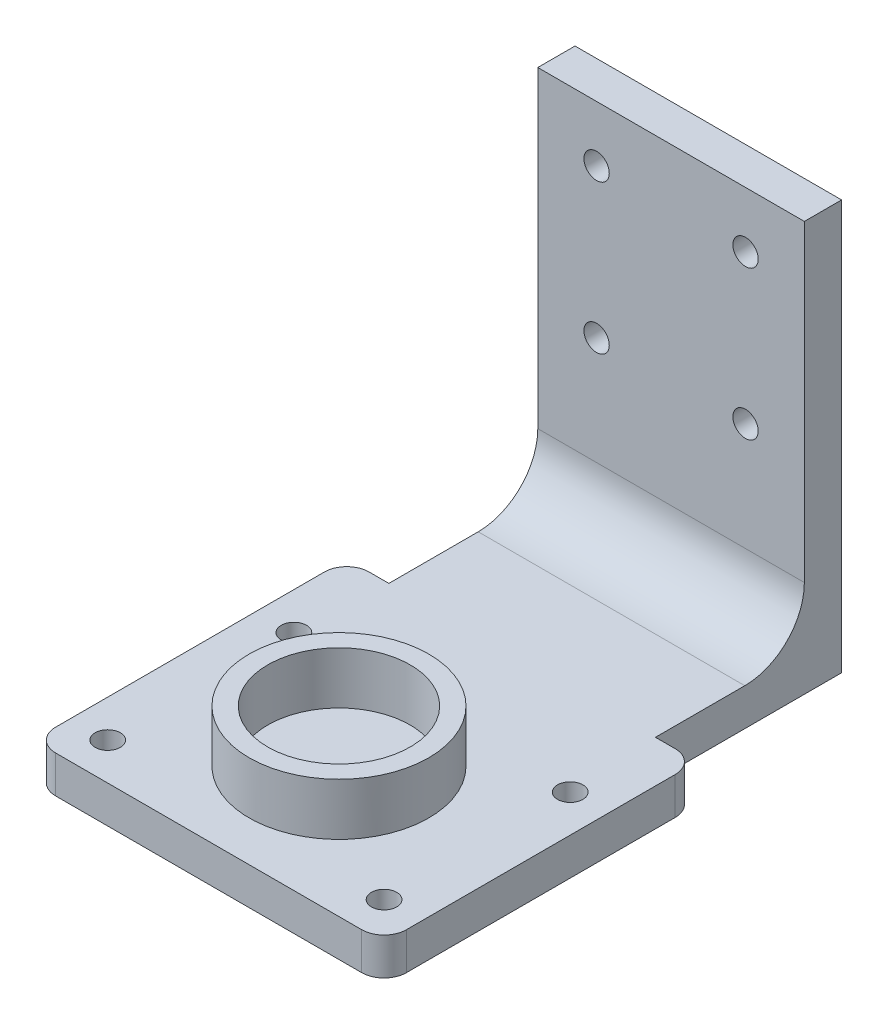
ISO-10303-21;
HEADER;
FILE_DESCRIPTION(('STEP AP214'),'2;1');
FILE_NAME('part.step','',(''),(''),'','','');
FILE_SCHEMA(('AUTOMOTIVE_DESIGN { 1 0 10303 214 1 1 1 1 }'));
ENDSEC;
DATA;
#1=APPLICATION_CONTEXT('core data for automotive mechanical design processes');
#2=APPLICATION_PROTOCOL_DEFINITION('international standard','automotive_design',2000,#1);
#3=PRODUCT_CONTEXT('',#1,'mechanical');
#4=PRODUCT('Part','Part','',(#3));
#5=PRODUCT_RELATED_PRODUCT_CATEGORY('part','',(#4));
#6=PRODUCT_DEFINITION_FORMATION('','',#4);
#7=PRODUCT_DEFINITION_CONTEXT('part definition',#1,'design');
#8=PRODUCT_DEFINITION('design','',#6,#7);
#9=PRODUCT_DEFINITION_SHAPE('','',#8);
#10=(LENGTH_UNIT() NAMED_UNIT(*) SI_UNIT(.MILLI.,.METRE.));
#11=(NAMED_UNIT(*) PLANE_ANGLE_UNIT() SI_UNIT($,.RADIAN.));
#12=(NAMED_UNIT(*) SI_UNIT($,.STERADIAN.) SOLID_ANGLE_UNIT());
#13=UNCERTAINTY_MEASURE_WITH_UNIT(LENGTH_MEASURE(1.E-05),#10,'distance_accuracy_value','');
#14=(GEOMETRIC_REPRESENTATION_CONTEXT(3) GLOBAL_UNCERTAINTY_ASSIGNED_CONTEXT((#13)) GLOBAL_UNIT_ASSIGNED_CONTEXT((#10,
#11,#12)) REPRESENTATION_CONTEXT('',''));
#15=CARTESIAN_POINT('',(0.,0.,0.));
#16=DIRECTION('',(0.,0.,1.));
#17=DIRECTION('',(1.,0.,0.));
#18=AXIS2_PLACEMENT_3D('',#15,#16,#17);
#19=CARTESIAN_POINT('',(0.,5.,0.));
#20=DIRECTION('',(0.,-1.,0.));
#21=DIRECTION('',(0.,0.,-1.));
#22=AXIS2_PLACEMENT_3D('',#19,#20,#21);
#23=PLANE('',#22);
#24=CARTESIAN_POINT('',(0.,5.,0.));
#25=DIRECTION('',(0.,-1.,0.));
#26=DIRECTION('',(0.,0.,-1.));
#27=AXIS2_PLACEMENT_3D('',#24,#25,#26);
#28=CIRCLE('',#27,12.065);
#29=CARTESIAN_POINT('',(0.,5.,-12.065));
#30=VERTEX_POINT('',#29);
#31=EDGE_CURVE('E318',#30,#30,#28,.F.);
#32=ORIENTED_EDGE('',*,*,#31,.F.);
#33=EDGE_LOOP('',(#32));
#34=FACE_BOUND('',#33,.T.);
#35=DIRECTION('',(0.,0.,-1.));
#36=VECTOR('',#35,1.);
#37=CARTESIAN_POINT('',(17.9,5.,0.));
#38=LINE('',#37,#36);
#39=CARTESIAN_POINT('',(17.9,5.,-24.6));
#40=VERTEX_POINT('',#39);
#41=CARTESIAN_POINT('',(17.9,5.,-36.6));
#42=VERTEX_POINT('',#41);
#43=EDGE_CURVE('E155',#40,#42,#38,.T.);
#44=ORIENTED_EDGE('',*,*,#43,.T.);
#45=DIRECTION('',(-1.,0.,0.));
#46=VECTOR('',#45,1.);
#47=CARTESIAN_POINT('',(0.,5.,-36.6));
#48=LINE('',#47,#46);
#49=CARTESIAN_POINT('',(-17.9,5.,-36.6));
#50=VERTEX_POINT('',#49);
#51=EDGE_CURVE('E383',#42,#50,#48,.T.);
#52=ORIENTED_EDGE('',*,*,#51,.T.);
#53=DIRECTION('',(0.,0.,1.));
#54=VECTOR('',#53,1.);
#55=CARTESIAN_POINT('',(-17.9,5.,0.));
#56=LINE('',#55,#54);
#57=CARTESIAN_POINT('',(-17.9,5.,-24.6));
#58=VERTEX_POINT('',#57);
#59=EDGE_CURVE('E211',#50,#58,#56,.T.);
#60=ORIENTED_EDGE('',*,*,#59,.T.);
#61=DIRECTION('',(-1.,0.,0.));
#62=VECTOR('',#61,1.);
#63=CARTESIAN_POINT('',(0.,5.,-24.6));
#64=LINE('',#63,#62);
#65=CARTESIAN_POINT('',(-20.555,5.,-24.6));
#66=VERTEX_POINT('',#65);
#67=EDGE_CURVE('E214',#58,#66,#64,.T.);
#68=ORIENTED_EDGE('',*,*,#67,.T.);
#69=CARTESIAN_POINT('',(-20.555,5.,-21.6));
#70=DIRECTION('',(0.,-1.,0.));
#71=DIRECTION('',(0.,0.,-1.));
#72=AXIS2_PLACEMENT_3D('',#69,#70,#71);
#73=CIRCLE('',#72,3.);
#74=CARTESIAN_POINT('',(-23.555,5.,-21.6));
#75=VERTEX_POINT('',#74);
#76=EDGE_CURVE('E343',#66,#75,#73,.F.);
#77=ORIENTED_EDGE('',*,*,#76,.T.);
#78=DIRECTION('',(0.,0.,1.));
#79=VECTOR('',#78,1.);
#80=CARTESIAN_POINT('',(-23.555,5.,-17.5));
#81=LINE('',#80,#79);
#82=CARTESIAN_POINT('',(-23.555,5.,14.5));
#83=VERTEX_POINT('',#82);
#84=EDGE_CURVE('E305',#75,#83,#81,.T.);
#85=ORIENTED_EDGE('',*,*,#84,.T.);
#86=CARTESIAN_POINT('',(-20.555,5.,14.5));
#87=DIRECTION('',(0.,-1.,0.));
#88=DIRECTION('',(0.,0.,-1.));
#89=AXIS2_PLACEMENT_3D('',#86,#87,#88);
#90=CIRCLE('',#89,3.);
#91=CARTESIAN_POINT('',(-20.555,5.,17.5));
#92=VERTEX_POINT('',#91);
#93=EDGE_CURVE('E340',#83,#92,#90,.F.);
#94=ORIENTED_EDGE('',*,*,#93,.T.);
#95=DIRECTION('',(1.,0.,0.));
#96=VECTOR('',#95,1.);
#97=CARTESIAN_POINT('',(-23.555,5.,17.5));
#98=LINE('',#97,#96);
#99=CARTESIAN_POINT('',(20.555,5.,17.5));
#100=VERTEX_POINT('',#99);
#101=EDGE_CURVE('E309',#92,#100,#98,.T.);
#102=ORIENTED_EDGE('',*,*,#101,.T.);
#103=CARTESIAN_POINT('',(20.555,5.,14.5));
#104=DIRECTION('',(0.,-1.,0.));
#105=DIRECTION('',(0.,0.,-1.));
#106=AXIS2_PLACEMENT_3D('',#103,#104,#105);
#107=CIRCLE('',#106,3.);
#108=CARTESIAN_POINT('',(23.555,5.,14.5));
#109=VERTEX_POINT('',#108);
#110=EDGE_CURVE('E346',#100,#109,#107,.F.);
#111=ORIENTED_EDGE('',*,*,#110,.T.);
#112=DIRECTION('',(0.,0.,-1.));
#113=VECTOR('',#112,1.);
#114=CARTESIAN_POINT('',(23.555,5.,-17.5));
#115=LINE('',#114,#113);
#116=CARTESIAN_POINT('',(23.555,5.,-21.6));
#117=VERTEX_POINT('',#116);
#118=EDGE_CURVE('E314',#109,#117,#115,.T.);
#119=ORIENTED_EDGE('',*,*,#118,.T.);
#120=CARTESIAN_POINT('',(20.555,5.,-21.6));
#121=DIRECTION('',(0.,-1.,0.));
#122=DIRECTION('',(0.,0.,-1.));
#123=AXIS2_PLACEMENT_3D('',#120,#121,#122);
#124=CIRCLE('',#123,3.);
#125=CARTESIAN_POINT('',(20.555,5.,-24.6));
#126=VERTEX_POINT('',#125);
#127=EDGE_CURVE('E349',#117,#126,#124,.F.);
#128=ORIENTED_EDGE('',*,*,#127,.T.);
#129=DIRECTION('',(-1.,0.,0.));
#130=VECTOR('',#129,1.);
#131=CARTESIAN_POINT('',(0.,5.,-24.6));
#132=LINE('',#131,#130);
#133=EDGE_CURVE('E188',#126,#40,#132,.T.);
#134=ORIENTED_EDGE('',*,*,#133,.T.);
#135=EDGE_LOOP('',(#44,#52,#60,#68,#77,#85,#94,#102,#111,#119,#128,#134));
#136=FACE_BOUND('',#135,.T.);
#137=CARTESIAN_POINT('',(-18.555,5.,12.5));
#138=DIRECTION('',(0.,1.,0.));
#139=DIRECTION('',(0.,0.,1.));
#140=AXIS2_PLACEMENT_3D('',#137,#138,#139);
#141=CIRCLE('',#140,1.7);
#142=CARTESIAN_POINT('',(-18.555,5.,14.2));
#143=VERTEX_POINT('',#142);
#144=EDGE_CURVE('E297',#143,#143,#141,.T.);
#145=ORIENTED_EDGE('',*,*,#144,.F.);
#146=EDGE_LOOP('',(#145));
#147=FACE_BOUND('',#146,.T.);
#148=CARTESIAN_POINT('',(-18.555,5.,-12.5));
#149=DIRECTION('',(0.,1.,0.));
#150=DIRECTION('',(0.,0.,-1.));
#151=AXIS2_PLACEMENT_3D('',#148,#149,#150);
#152=CIRCLE('',#151,1.7);
#153=CARTESIAN_POINT('',(-18.555,5.,-14.2));
#154=VERTEX_POINT('',#153);
#155=EDGE_CURVE('E289',#154,#154,#152,.T.);
#156=ORIENTED_EDGE('',*,*,#155,.F.);
#157=EDGE_LOOP('',(#156));
#158=FACE_BOUND('',#157,.T.);
#159=CARTESIAN_POINT('',(18.555,5.,12.5));
#160=DIRECTION('',(0.,1.,0.));
#161=DIRECTION('',(0.,0.,-1.));
#162=AXIS2_PLACEMENT_3D('',#159,#160,#161);
#163=CIRCLE('',#162,1.7);
#164=CARTESIAN_POINT('',(18.555,5.,10.8));
#165=VERTEX_POINT('',#164);
#166=EDGE_CURVE('E281',#165,#165,#163,.T.);
#167=ORIENTED_EDGE('',*,*,#166,.F.);
#168=EDGE_LOOP('',(#167));
#169=FACE_BOUND('',#168,.T.);
#170=CARTESIAN_POINT('',(18.555,5.,-12.5));
#171=DIRECTION('',(0.,1.,0.));
#172=DIRECTION('',(0.,0.,1.));
#173=AXIS2_PLACEMENT_3D('',#170,#171,#172);
#174=CIRCLE('',#173,1.7);
#175=CARTESIAN_POINT('',(18.555,5.,-10.8));
#176=VERTEX_POINT('',#175);
#177=EDGE_CURVE('E273',#176,#176,#174,.T.);
#178=ORIENTED_EDGE('',*,*,#177,.F.);
#179=EDGE_LOOP('',(#178));
#180=FACE_BOUND('',#179,.T.);
#181=ADVANCED_FACE('F41',(#34,#136,#147,#158,#169,#180),#23,.F.);
#182=CARTESIAN_POINT('',(0.,0.,0.));
#183=DIRECTION('',(0.,-1.,0.));
#184=DIRECTION('',(0.,0.,-1.));
#185=AXIS2_PLACEMENT_3D('',#182,#183,#184);
#186=PLANE('',#185);
#187=DIRECTION('',(1.,0.,0.));
#188=VECTOR('',#187,1.);
#189=CARTESIAN_POINT('',(23.555,0.,-24.6));
#190=LINE('',#189,#188);
#191=CARTESIAN_POINT('',(17.9,0.,-24.6));
#192=VERTEX_POINT('',#191);
#193=CARTESIAN_POINT('',(20.555,0.,-24.6));
#194=VERTEX_POINT('',#193);
#195=EDGE_CURVE('E163',#192,#194,#190,.T.);
#196=ORIENTED_EDGE('',*,*,#195,.T.);
#197=CARTESIAN_POINT('',(20.555,0.,-21.6));
#198=DIRECTION('',(0.,-1.,0.));
#199=DIRECTION('',(0.,0.,-1.));
#200=AXIS2_PLACEMENT_3D('',#197,#198,#199);
#201=CIRCLE('',#200,3.);
#202=CARTESIAN_POINT('',(23.555,0.,-21.6));
#203=VERTEX_POINT('',#202);
#204=EDGE_CURVE('E363',#194,#203,#201,.T.);
#205=ORIENTED_EDGE('',*,*,#204,.T.);
#206=DIRECTION('',(0.,0.,-1.));
#207=VECTOR('',#206,1.);
#208=CARTESIAN_POINT('',(23.555,0.,-44.6));
#209=LINE('',#208,#207);
#210=CARTESIAN_POINT('',(23.555,0.,14.5));
#211=VERTEX_POINT('',#210);
#212=EDGE_CURVE('E310',#211,#203,#209,.T.);
#213=ORIENTED_EDGE('',*,*,#212,.F.);
#214=CARTESIAN_POINT('',(20.555,0.,14.5));
#215=DIRECTION('',(0.,-1.,0.));
#216=DIRECTION('',(0.,0.,-1.));
#217=AXIS2_PLACEMENT_3D('',#214,#215,#216);
#218=CIRCLE('',#217,3.);
#219=CARTESIAN_POINT('',(20.555,0.,17.5));
#220=VERTEX_POINT('',#219);
#221=EDGE_CURVE('E360',#211,#220,#218,.T.);
#222=ORIENTED_EDGE('',*,*,#221,.T.);
#223=DIRECTION('',(1.,0.,0.));
#224=VECTOR('',#223,1.);
#225=CARTESIAN_POINT('',(-23.555,0.,17.5));
#226=LINE('',#225,#224);
#227=CARTESIAN_POINT('',(-20.555,0.,17.5));
#228=VERTEX_POINT('',#227);
#229=EDGE_CURVE('E322',#228,#220,#226,.T.);
#230=ORIENTED_EDGE('',*,*,#229,.F.);
#231=CARTESIAN_POINT('',(-20.555,0.,14.5));
#232=DIRECTION('',(0.,-1.,0.));
#233=DIRECTION('',(0.,0.,-1.));
#234=AXIS2_PLACEMENT_3D('',#231,#232,#233);
#235=CIRCLE('',#234,3.);
#236=CARTESIAN_POINT('',(-23.555,0.,14.5));
#237=VERTEX_POINT('',#236);
#238=EDGE_CURVE('E354',#228,#237,#235,.T.);
#239=ORIENTED_EDGE('',*,*,#238,.T.);
#240=DIRECTION('',(0.,0.,1.));
#241=VECTOR('',#240,1.);
#242=CARTESIAN_POINT('',(-23.555,0.,-17.5));
#243=LINE('',#242,#241);
#244=CARTESIAN_POINT('',(-23.555,0.,-21.6));
#245=VERTEX_POINT('',#244);
#246=EDGE_CURVE('E301',#245,#237,#243,.T.);
#247=ORIENTED_EDGE('',*,*,#246,.F.);
#248=CARTESIAN_POINT('',(-20.555,0.,-21.6));
#249=DIRECTION('',(0.,-1.,0.));
#250=DIRECTION('',(0.,0.,-1.));
#251=AXIS2_PLACEMENT_3D('',#248,#249,#250);
#252=CIRCLE('',#251,3.);
#253=CARTESIAN_POINT('',(-20.555,0.,-24.6));
#254=VERTEX_POINT('',#253);
#255=EDGE_CURVE('E357',#245,#254,#252,.T.);
#256=ORIENTED_EDGE('',*,*,#255,.T.);
#257=DIRECTION('',(1.,0.,0.));
#258=VECTOR('',#257,1.);
#259=CARTESIAN_POINT('',(-23.555,0.,-24.6));
#260=LINE('',#259,#258);
#261=CARTESIAN_POINT('',(-17.9,0.,-24.6));
#262=VERTEX_POINT('',#261);
#263=EDGE_CURVE('E192',#254,#262,#260,.T.);
#264=ORIENTED_EDGE('',*,*,#263,.T.);
#265=DIRECTION('',(0.,0.,-1.));
#266=VECTOR('',#265,1.);
#267=CARTESIAN_POINT('',(-17.9,0.,-24.6));
#268=LINE('',#267,#266);
#269=CARTESIAN_POINT('',(-17.9,0.,-49.6));
#270=VERTEX_POINT('',#269);
#271=EDGE_CURVE('E195',#262,#270,#268,.T.);
#272=ORIENTED_EDGE('',*,*,#271,.T.);
#273=DIRECTION('',(-1.,0.,0.));
#274=VECTOR('',#273,1.);
#275=CARTESIAN_POINT('',(-23.555,0.,-49.6));
#276=LINE('',#275,#274);
#277=CARTESIAN_POINT('',(17.9,0.,-49.6));
#278=VERTEX_POINT('',#277);
#279=EDGE_CURVE('E175',#278,#270,#276,.T.);
#280=ORIENTED_EDGE('',*,*,#279,.F.);
#281=DIRECTION('',(0.,0.,1.));
#282=VECTOR('',#281,1.);
#283=CARTESIAN_POINT('',(17.9,0.,-24.6));
#284=LINE('',#283,#282);
#285=EDGE_CURVE('E152',#278,#192,#284,.T.);
#286=ORIENTED_EDGE('',*,*,#285,.T.);
#287=EDGE_LOOP('',(#196,#205,#213,#222,#230,#239,#247,#256,#264,#272,#280,#286));
#288=FACE_BOUND('',#287,.T.);
#289=CARTESIAN_POINT('',(18.555,0.,12.5));
#290=DIRECTION('',(0.,1.,0.));
#291=DIRECTION('',(0.,0.,-1.));
#292=AXIS2_PLACEMENT_3D('',#289,#290,#291);
#293=CIRCLE('',#292,1.7);
#294=CARTESIAN_POINT('',(18.555,0.,10.8));
#295=VERTEX_POINT('',#294);
#296=EDGE_CURVE('E277',#295,#295,#293,.T.);
#297=ORIENTED_EDGE('',*,*,#296,.T.);
#298=EDGE_LOOP('',(#297));
#299=FACE_BOUND('',#298,.T.);
#300=CARTESIAN_POINT('',(-18.555,0.,12.5));
#301=DIRECTION('',(0.,1.,0.));
#302=DIRECTION('',(0.,0.,1.));
#303=AXIS2_PLACEMENT_3D('',#300,#301,#302);
#304=CIRCLE('',#303,1.7);
#305=CARTESIAN_POINT('',(-18.555,0.,14.2));
#306=VERTEX_POINT('',#305);
#307=EDGE_CURVE('E293',#306,#306,#304,.T.);
#308=ORIENTED_EDGE('',*,*,#307,.T.);
#309=EDGE_LOOP('',(#308));
#310=FACE_BOUND('',#309,.T.);
#311=CARTESIAN_POINT('',(-18.555,0.,-12.5));
#312=DIRECTION('',(0.,1.,0.));
#313=DIRECTION('',(0.,0.,-1.));
#314=AXIS2_PLACEMENT_3D('',#311,#312,#313);
#315=CIRCLE('',#314,1.7);
#316=CARTESIAN_POINT('',(-18.555,0.,-14.2));
#317=VERTEX_POINT('',#316);
#318=EDGE_CURVE('E285',#317,#317,#315,.T.);
#319=ORIENTED_EDGE('',*,*,#318,.T.);
#320=EDGE_LOOP('',(#319));
#321=FACE_BOUND('',#320,.T.);
#322=CARTESIAN_POINT('',(18.555,0.,-12.5));
#323=DIRECTION('',(0.,1.,0.));
#324=DIRECTION('',(0.,0.,1.));
#325=AXIS2_PLACEMENT_3D('',#322,#323,#324);
#326=CIRCLE('',#325,1.7);
#327=CARTESIAN_POINT('',(18.555,0.,-10.8));
#328=VERTEX_POINT('',#327);
#329=EDGE_CURVE('E272',#328,#328,#326,.T.);
#330=ORIENTED_EDGE('',*,*,#329,.T.);
#331=EDGE_LOOP('',(#330));
#332=FACE_BOUND('',#331,.T.);
#333=ADVANCED_FACE('F172',(#288,#299,#310,#321,#332),#186,.T.);
#334=CARTESIAN_POINT('',(-23.555,5.,-17.5));
#335=DIRECTION('',(1.,0.,0.));
#336=DIRECTION('',(0.,0.,-1.));
#337=AXIS2_PLACEMENT_3D('',#334,#335,#336);
#338=PLANE('',#337);
#339=ORIENTED_EDGE('',*,*,#84,.F.);
#340=DIRECTION('',(0.,1.,0.));
#341=VECTOR('',#340,1.);
#342=CARTESIAN_POINT('',(-23.555,5.,-21.6));
#343=LINE('',#342,#341);
#344=EDGE_CURVE('E380',#75,#245,#343,.F.);
#345=ORIENTED_EDGE('',*,*,#344,.T.);
#346=ORIENTED_EDGE('',*,*,#246,.T.);
#347=DIRECTION('',(0.,-1.,0.));
#348=VECTOR('',#347,1.);
#349=CARTESIAN_POINT('',(-23.555,5.,14.5));
#350=LINE('',#349,#348);
#351=EDGE_CURVE('E377',#237,#83,#350,.F.);
#352=ORIENTED_EDGE('',*,*,#351,.T.);
#353=EDGE_LOOP('',(#339,#345,#346,#352));
#354=FACE_BOUND('',#353,.T.);
#355=ADVANCED_FACE('F408',(#354),#338,.F.);
#356=CARTESIAN_POINT('',(-23.555,5.,17.5));
#357=DIRECTION('',(0.,0.,-1.));
#358=DIRECTION('',(-1.,0.,0.));
#359=AXIS2_PLACEMENT_3D('',#356,#357,#358);
#360=PLANE('',#359);
#361=ORIENTED_EDGE('',*,*,#229,.T.);
#362=DIRECTION('',(0.,-1.,0.));
#363=VECTOR('',#362,1.);
#364=CARTESIAN_POINT('',(20.555,5.,17.5));
#365=LINE('',#364,#363);
#366=EDGE_CURVE('E370',#220,#100,#365,.F.);
#367=ORIENTED_EDGE('',*,*,#366,.T.);
#368=ORIENTED_EDGE('',*,*,#101,.F.);
#369=DIRECTION('',(0.,-1.,0.));
#370=VECTOR('',#369,1.);
#371=CARTESIAN_POINT('',(-20.555,5.,17.5));
#372=LINE('',#371,#370);
#373=EDGE_CURVE('E366',#92,#228,#372,.T.);
#374=ORIENTED_EDGE('',*,*,#373,.T.);
#375=EDGE_LOOP('',(#361,#367,#368,#374));
#376=FACE_BOUND('',#375,.T.);
#377=ADVANCED_FACE('F420',(#376),#360,.F.);
#378=CARTESIAN_POINT('',(23.555,5.,-44.6));
#379=DIRECTION('',(-1.,0.,0.));
#380=DIRECTION('',(0.,0.,1.));
#381=AXIS2_PLACEMENT_3D('',#378,#379,#380);
#382=PLANE('',#381);
#383=ORIENTED_EDGE('',*,*,#212,.T.);
#384=DIRECTION('',(0.,1.,0.));
#385=VECTOR('',#384,1.);
#386=CARTESIAN_POINT('',(23.555,5.,-21.6));
#387=LINE('',#386,#385);
#388=EDGE_CURVE('E336',#203,#117,#387,.T.);
#389=ORIENTED_EDGE('',*,*,#388,.T.);
#390=ORIENTED_EDGE('',*,*,#118,.F.);
#391=DIRECTION('',(0.,-1.,0.));
#392=VECTOR('',#391,1.);
#393=CARTESIAN_POINT('',(23.555,5.,14.5));
#394=LINE('',#393,#392);
#395=EDGE_CURVE('E332',#109,#211,#394,.T.);
#396=ORIENTED_EDGE('',*,*,#395,.T.);
#397=EDGE_LOOP('',(#383,#389,#390,#396));
#398=FACE_BOUND('',#397,.T.);
#399=ADVANCED_FACE('F427',(#398),#382,.F.);
#400=CARTESIAN_POINT('',(-18.555,5.,12.5));
#401=DIRECTION('',(0.,-1.,0.));
#402=DIRECTION('',(0.,0.,-1.));
#403=AXIS2_PLACEMENT_3D('',#400,#401,#402);
#404=CYLINDRICAL_SURFACE('',#403,1.7);
#405=ORIENTED_EDGE('',*,*,#144,.T.);
#406=EDGE_LOOP('',(#405));
#407=FACE_BOUND('',#406,.T.);
#408=ORIENTED_EDGE('',*,*,#307,.F.);
#409=EDGE_LOOP('',(#408));
#410=FACE_BOUND('',#409,.T.);
#411=ADVANCED_FACE('F487',(#407,#410),#404,.F.);
#412=CARTESIAN_POINT('',(-18.555,5.,-12.5));
#413=DIRECTION('',(0.,-1.,0.));
#414=DIRECTION('',(0.,0.,-1.));
#415=AXIS2_PLACEMENT_3D('',#412,#413,#414);
#416=CYLINDRICAL_SURFACE('',#415,1.7);
#417=ORIENTED_EDGE('',*,*,#155,.T.);
#418=EDGE_LOOP('',(#417));
#419=FACE_BOUND('',#418,.T.);
#420=ORIENTED_EDGE('',*,*,#318,.F.);
#421=EDGE_LOOP('',(#420));
#422=FACE_BOUND('',#421,.T.);
#423=ADVANCED_FACE('F484',(#419,#422),#416,.F.);
#424=CARTESIAN_POINT('',(18.555,5.,12.5));
#425=DIRECTION('',(0.,-1.,0.));
#426=DIRECTION('',(0.,0.,-1.));
#427=AXIS2_PLACEMENT_3D('',#424,#425,#426);
#428=CYLINDRICAL_SURFACE('',#427,1.7);
#429=ORIENTED_EDGE('',*,*,#166,.T.);
#430=EDGE_LOOP('',(#429));
#431=FACE_BOUND('',#430,.T.);
#432=ORIENTED_EDGE('',*,*,#296,.F.);
#433=EDGE_LOOP('',(#432));
#434=FACE_BOUND('',#433,.T.);
#435=ADVANCED_FACE('F480',(#431,#434),#428,.F.);
#436=CARTESIAN_POINT('',(18.555,5.,-12.5));
#437=DIRECTION('',(0.,-1.,0.));
#438=DIRECTION('',(0.,0.,-1.));
#439=AXIS2_PLACEMENT_3D('',#436,#437,#438);
#440=CYLINDRICAL_SURFACE('',#439,1.7);
#441=ORIENTED_EDGE('',*,*,#177,.T.);
#442=EDGE_LOOP('',(#441));
#443=FACE_BOUND('',#442,.T.);
#444=ORIENTED_EDGE('',*,*,#329,.F.);
#445=EDGE_LOOP('',(#444));
#446=FACE_BOUND('',#445,.T.);
#447=ADVANCED_FACE('F475',(#443,#446),#440,.F.);
#448=CARTESIAN_POINT('',(0.,12.,0.));
#449=DIRECTION('',(0.,1.,0.));
#450=DIRECTION('',(0.,0.,1.));
#451=AXIS2_PLACEMENT_3D('',#448,#449,#450);
#452=PLANE('',#451);
#453=CARTESIAN_POINT('',(0.,12.,0.));
#454=DIRECTION('',(0.,1.,0.));
#455=DIRECTION('',(0.,0.,1.));
#456=AXIS2_PLACEMENT_3D('',#453,#454,#455);
#457=CIRCLE('',#456,12.065);
#458=CARTESIAN_POINT('',(0.,12.,12.065));
#459=VERTEX_POINT('',#458);
#460=EDGE_CURVE('E265',#459,#459,#457,.T.);
#461=ORIENTED_EDGE('',*,*,#460,.T.);
#462=EDGE_LOOP('',(#461));
#463=FACE_BOUND('',#462,.T.);
#464=CARTESIAN_POINT('',(0.,12.,0.));
#465=DIRECTION('',(0.,1.,0.));
#466=DIRECTION('',(0.,0.,1.));
#467=AXIS2_PLACEMENT_3D('',#464,#465,#466);
#468=CIRCLE('',#467,9.565);
#469=CARTESIAN_POINT('',(0.,12.,9.565));
#470=VERTEX_POINT('',#469);
#471=EDGE_CURVE('E261',#470,#470,#468,.T.);
#472=ORIENTED_EDGE('',*,*,#471,.F.);
#473=EDGE_LOOP('',(#472));
#474=FACE_BOUND('',#473,.T.);
#475=ADVANCED_FACE('F469',(#463,#474),#452,.T.);
#476=CARTESIAN_POINT('',(0.,12.,0.));
#477=DIRECTION('',(0.,-1.,0.));
#478=DIRECTION('',(0.,0.,-1.));
#479=AXIS2_PLACEMENT_3D('',#476,#477,#478);
#480=CYLINDRICAL_SURFACE('',#479,12.065);
#481=ORIENTED_EDGE('',*,*,#460,.F.);
#482=EDGE_LOOP('',(#481));
#483=FACE_BOUND('',#482,.T.);
#484=ORIENTED_EDGE('',*,*,#31,.T.);
#485=EDGE_LOOP('',(#484));
#486=FACE_BOUND('',#485,.T.);
#487=ADVANCED_FACE('F461',(#483,#486),#480,.T.);
#488=CARTESIAN_POINT('',(0.,12.,0.));
#489=DIRECTION('',(0.,-1.,0.));
#490=DIRECTION('',(0.,0.,-1.));
#491=AXIS2_PLACEMENT_3D('',#488,#489,#490);
#492=CYLINDRICAL_SURFACE('',#491,9.565);
#493=ORIENTED_EDGE('',*,*,#471,.T.);
#494=EDGE_LOOP('',(#493));
#495=FACE_BOUND('',#494,.T.);
#496=CARTESIAN_POINT('',(0.,5.,0.));
#497=DIRECTION('',(0.,1.,0.));
#498=DIRECTION('',(0.,0.,1.));
#499=AXIS2_PLACEMENT_3D('',#496,#497,#498);
#500=CIRCLE('',#499,9.565);
#501=CARTESIAN_POINT('',(0.,5.,9.565));
#502=VERTEX_POINT('',#501);
#503=EDGE_CURVE('E257',#502,#502,#500,.T.);
#504=ORIENTED_EDGE('',*,*,#503,.F.);
#505=EDGE_LOOP('',(#504));
#506=FACE_BOUND('',#505,.T.);
#507=ADVANCED_FACE('F453',(#495,#506),#492,.F.);
#508=ORIENTED_EDGE('',*,*,#503,.T.);
#509=EDGE_LOOP('',(#508));
#510=FACE_BOUND('',#509,.T.);
#511=ADVANCED_FACE('F444',(#510),#23,.F.);
#512=CARTESIAN_POINT('',(0.,0.,-44.6));
#513=DIRECTION('',(0.,0.,1.));
#514=DIRECTION('',(1.,0.,0.));
#515=AXIS2_PLACEMENT_3D('',#512,#513,#514);
#516=PLANE('',#515);
#517=DIRECTION('',(0.,1.,0.));
#518=VECTOR('',#517,1.);
#519=CARTESIAN_POINT('',(-17.9,0.,-44.6));
#520=LINE('',#519,#518);
#521=CARTESIAN_POINT('',(-17.9,13.,-44.6));
#522=VERTEX_POINT('',#521);
#523=CARTESIAN_POINT('',(-17.9,55.,-44.6));
#524=VERTEX_POINT('',#523);
#525=EDGE_CURVE('E205',#522,#524,#520,.T.);
#526=ORIENTED_EDGE('',*,*,#525,.F.);
#527=DIRECTION('',(-1.,0.,0.));
#528=VECTOR('',#527,1.);
#529=CARTESIAN_POINT('',(0.,13.,-44.6));
#530=LINE('',#529,#528);
#531=CARTESIAN_POINT('',(17.9,13.,-44.6));
#532=VERTEX_POINT('',#531);
#533=EDGE_CURVE('E63',#522,#532,#530,.F.);
#534=ORIENTED_EDGE('',*,*,#533,.T.);
#535=DIRECTION('',(0.,-1.,0.));
#536=VECTOR('',#535,1.);
#537=CARTESIAN_POINT('',(17.9,0.,-44.6));
#538=LINE('',#537,#536);
#539=CARTESIAN_POINT('',(17.9,55.,-44.6));
#540=VERTEX_POINT('',#539);
#541=EDGE_CURVE('E159',#540,#532,#538,.T.);
#542=ORIENTED_EDGE('',*,*,#541,.F.);
#543=DIRECTION('',(1.,0.,0.));
#544=VECTOR('',#543,1.);
#545=CARTESIAN_POINT('',(23.555,55.,-44.6));
#546=LINE('',#545,#544);
#547=EDGE_CURVE('E250',#524,#540,#546,.T.);
#548=ORIENTED_EDGE('',*,*,#547,.F.);
#549=EDGE_LOOP('',(#526,#534,#542,#548));
#550=FACE_BOUND('',#549,.T.);
#551=CARTESIAN_POINT('',(10.,47.5,-44.6));
#552=DIRECTION('',(0.,0.,1.));
#553=DIRECTION('',(1.,0.,0.));
#554=AXIS2_PLACEMENT_3D('',#551,#552,#553);
#555=CIRCLE('',#554,1.7);
#556=CARTESIAN_POINT('',(11.7,47.5,-44.6));
#557=VERTEX_POINT('',#556);
#558=EDGE_CURVE('E238',#557,#557,#555,.T.);
#559=ORIENTED_EDGE('',*,*,#558,.F.);
#560=EDGE_LOOP('',(#559));
#561=FACE_BOUND('',#560,.T.);
#562=CARTESIAN_POINT('',(-10.,27.5,-44.6));
#563=DIRECTION('',(0.,0.,1.));
#564=DIRECTION('',(1.,0.,0.));
#565=AXIS2_PLACEMENT_3D('',#562,#563,#564);
#566=CIRCLE('',#565,1.7);
#567=CARTESIAN_POINT('',(-8.3,27.5,-44.6));
#568=VERTEX_POINT('',#567);
#569=EDGE_CURVE('E234',#568,#568,#566,.T.);
#570=ORIENTED_EDGE('',*,*,#569,.F.);
#571=EDGE_LOOP('',(#570));
#572=FACE_BOUND('',#571,.T.);
#573=CARTESIAN_POINT('',(-10.,47.5,-44.6));
#574=DIRECTION('',(0.,0.,1.));
#575=DIRECTION('',(1.,0.,0.));
#576=AXIS2_PLACEMENT_3D('',#573,#574,#575);
#577=CIRCLE('',#576,1.7);
#578=CARTESIAN_POINT('',(-8.3,47.5,-44.6));
#579=VERTEX_POINT('',#578);
#580=EDGE_CURVE('E223',#579,#579,#577,.T.);
#581=ORIENTED_EDGE('',*,*,#580,.F.);
#582=EDGE_LOOP('',(#581));
#583=FACE_BOUND('',#582,.T.);
#584=CARTESIAN_POINT('',(10.,27.5,-44.6));
#585=DIRECTION('',(0.,0.,1.));
#586=DIRECTION('',(1.,0.,0.));
#587=AXIS2_PLACEMENT_3D('',#584,#585,#586);
#588=CIRCLE('',#587,1.7);
#589=CARTESIAN_POINT('',(11.7,27.5,-44.6));
#590=VERTEX_POINT('',#589);
#591=EDGE_CURVE('E246',#590,#590,#588,.T.);
#592=ORIENTED_EDGE('',*,*,#591,.F.);
#593=EDGE_LOOP('',(#592));
#594=FACE_BOUND('',#593,.T.);
#595=ADVANCED_FACE('F452',(#550,#561,#572,#583,#594),#516,.T.);
#596=CARTESIAN_POINT('',(23.555,55.,-49.6));
#597=DIRECTION('',(0.,-1.,0.));
#598=DIRECTION('',(0.,0.,-1.));
#599=AXIS2_PLACEMENT_3D('',#596,#597,#598);
#600=PLANE('',#599);
#601=ORIENTED_EDGE('',*,*,#547,.T.);
#602=DIRECTION('',(0.,0.,1.));
#603=VECTOR('',#602,1.);
#604=CARTESIAN_POINT('',(17.9,55.,-24.6));
#605=LINE('',#604,#603);
#606=CARTESIAN_POINT('',(17.9,55.,-49.6));
#607=VERTEX_POINT('',#606);
#608=EDGE_CURVE('E177',#607,#540,#605,.T.);
#609=ORIENTED_EDGE('',*,*,#608,.F.);
#610=DIRECTION('',(1.,0.,0.));
#611=VECTOR('',#610,1.);
#612=CARTESIAN_POINT('',(23.555,55.,-49.6));
#613=LINE('',#612,#611);
#614=CARTESIAN_POINT('',(-17.9,55.,-49.6));
#615=VERTEX_POINT('',#614);
#616=EDGE_CURVE('E253',#615,#607,#613,.T.);
#617=ORIENTED_EDGE('',*,*,#616,.F.);
#618=DIRECTION('',(0.,0.,-1.));
#619=VECTOR('',#618,1.);
#620=CARTESIAN_POINT('',(-17.9,55.,-24.6));
#621=LINE('',#620,#619);
#622=EDGE_CURVE('E191',#524,#615,#621,.T.);
#623=ORIENTED_EDGE('',*,*,#622,.F.);
#624=EDGE_LOOP('',(#601,#609,#617,#623));
#625=FACE_BOUND('',#624,.T.);
#626=ADVANCED_FACE('F459',(#625),#600,.F.);
#627=CARTESIAN_POINT('',(0.,0.,-49.6));
#628=DIRECTION('',(0.,0.,1.));
#629=DIRECTION('',(1.,0.,0.));
#630=AXIS2_PLACEMENT_3D('',#627,#628,#629);
#631=PLANE('',#630);
#632=CARTESIAN_POINT('',(10.,47.5,-49.6));
#633=DIRECTION('',(0.,0.,-1.));
#634=DIRECTION('',(-1.,0.,0.));
#635=AXIS2_PLACEMENT_3D('',#632,#633,#634);
#636=CIRCLE('',#635,1.7);
#637=CARTESIAN_POINT('',(8.3,47.5,-49.6));
#638=VERTEX_POINT('',#637);
#639=EDGE_CURVE('E219',#638,#638,#636,.T.);
#640=ORIENTED_EDGE('',*,*,#639,.F.);
#641=EDGE_LOOP('',(#640));
#642=FACE_BOUND('',#641,.T.);
#643=CARTESIAN_POINT('',(-10.,27.5,-49.6));
#644=DIRECTION('',(0.,0.,-1.));
#645=DIRECTION('',(-1.,0.,0.));
#646=AXIS2_PLACEMENT_3D('',#643,#644,#645);
#647=CIRCLE('',#646,1.7);
#648=CARTESIAN_POINT('',(-11.7,27.5,-49.6));
#649=VERTEX_POINT('',#648);
#650=EDGE_CURVE('E224',#649,#649,#647,.T.);
#651=ORIENTED_EDGE('',*,*,#650,.F.);
#652=EDGE_LOOP('',(#651));
#653=FACE_BOUND('',#652,.T.);
#654=CARTESIAN_POINT('',(-10.,47.5,-49.6));
#655=DIRECTION('',(0.,0.,-1.));
#656=DIRECTION('',(-1.,0.,0.));
#657=AXIS2_PLACEMENT_3D('',#654,#655,#656);
#658=CIRCLE('',#657,1.7);
#659=CARTESIAN_POINT('',(-11.7,47.5,-49.6));
#660=VERTEX_POINT('',#659);
#661=EDGE_CURVE('E218',#660,#660,#658,.T.);
#662=ORIENTED_EDGE('',*,*,#661,.F.);
#663=EDGE_LOOP('',(#662));
#664=FACE_BOUND('',#663,.T.);
#665=CARTESIAN_POINT('',(10.,27.5,-49.6));
#666=DIRECTION('',(0.,0.,-1.));
#667=DIRECTION('',(-1.,0.,0.));
#668=AXIS2_PLACEMENT_3D('',#665,#666,#667);
#669=CIRCLE('',#668,1.7);
#670=CARTESIAN_POINT('',(8.3,27.5,-49.6));
#671=VERTEX_POINT('',#670);
#672=EDGE_CURVE('E242',#671,#671,#669,.T.);
#673=ORIENTED_EDGE('',*,*,#672,.F.);
#674=EDGE_LOOP('',(#673));
#675=FACE_BOUND('',#674,.T.);
#676=ORIENTED_EDGE('',*,*,#616,.T.);
#677=DIRECTION('',(0.,1.,0.));
#678=VECTOR('',#677,1.);
#679=CARTESIAN_POINT('',(17.9,0.,-49.6));
#680=LINE('',#679,#678);
#681=EDGE_CURVE('E160',#278,#607,#680,.T.);
#682=ORIENTED_EDGE('',*,*,#681,.F.);
#683=ORIENTED_EDGE('',*,*,#279,.T.);
#684=DIRECTION('',(0.,1.,0.));
#685=VECTOR('',#684,1.);
#686=CARTESIAN_POINT('',(-17.9,0.,-49.6));
#687=LINE('',#686,#685);
#688=EDGE_CURVE('E201',#270,#615,#687,.T.);
#689=ORIENTED_EDGE('',*,*,#688,.T.);
#690=EDGE_LOOP('',(#676,#682,#683,#689));
#691=FACE_BOUND('',#690,.T.);
#692=ADVANCED_FACE('F622',(#642,#653,#664,#675,#691),#631,.F.);
#693=CARTESIAN_POINT('',(10.,27.5,17.5));
#694=DIRECTION('',(0.,0.,-1.));
#695=DIRECTION('',(-1.,0.,0.));
#696=AXIS2_PLACEMENT_3D('',#693,#694,#695);
#697=CYLINDRICAL_SURFACE('',#696,1.7);
#698=ORIENTED_EDGE('',*,*,#591,.T.);
#699=EDGE_LOOP('',(#698));
#700=FACE_BOUND('',#699,.T.);
#701=ORIENTED_EDGE('',*,*,#672,.T.);
#702=EDGE_LOOP('',(#701));
#703=FACE_BOUND('',#702,.T.);
#704=ADVANCED_FACE('F624',(#700,#703),#697,.F.);
#705=CARTESIAN_POINT('',(-10.,47.5,17.5));
#706=DIRECTION('',(0.,0.,-1.));
#707=DIRECTION('',(-1.,0.,0.));
#708=AXIS2_PLACEMENT_3D('',#705,#706,#707);
#709=CYLINDRICAL_SURFACE('',#708,1.7);
#710=ORIENTED_EDGE('',*,*,#580,.T.);
#711=EDGE_LOOP('',(#710));
#712=FACE_BOUND('',#711,.T.);
#713=ORIENTED_EDGE('',*,*,#661,.T.);
#714=EDGE_LOOP('',(#713));
#715=FACE_BOUND('',#714,.T.);
#716=ADVANCED_FACE('F630',(#712,#715),#709,.F.);
#717=CARTESIAN_POINT('',(-10.,27.5,17.5));
#718=DIRECTION('',(0.,0.,-1.));
#719=DIRECTION('',(-1.,0.,0.));
#720=AXIS2_PLACEMENT_3D('',#717,#718,#719);
#721=CYLINDRICAL_SURFACE('',#720,1.7);
#722=ORIENTED_EDGE('',*,*,#569,.T.);
#723=EDGE_LOOP('',(#722));
#724=FACE_BOUND('',#723,.T.);
#725=ORIENTED_EDGE('',*,*,#650,.T.);
#726=EDGE_LOOP('',(#725));
#727=FACE_BOUND('',#726,.T.);
#728=ADVANCED_FACE('F638',(#724,#727),#721,.F.);
#729=CARTESIAN_POINT('',(10.,47.5,17.5));
#730=DIRECTION('',(0.,0.,-1.));
#731=DIRECTION('',(-1.,0.,0.));
#732=AXIS2_PLACEMENT_3D('',#729,#730,#731);
#733=CYLINDRICAL_SURFACE('',#732,1.7);
#734=ORIENTED_EDGE('',*,*,#558,.T.);
#735=EDGE_LOOP('',(#734));
#736=FACE_BOUND('',#735,.T.);
#737=ORIENTED_EDGE('',*,*,#639,.T.);
#738=EDGE_LOOP('',(#737));
#739=FACE_BOUND('',#738,.T.);
#740=ADVANCED_FACE('F543',(#736,#739),#733,.F.);
#741=CARTESIAN_POINT('',(-23.555,0.,-24.6));
#742=DIRECTION('',(0.,0.,1.));
#743=DIRECTION('',(1.,0.,0.));
#744=AXIS2_PLACEMENT_3D('',#741,#742,#743);
#745=PLANE('',#744);
#746=ORIENTED_EDGE('',*,*,#263,.F.);
#747=DIRECTION('',(0.,1.,0.));
#748=VECTOR('',#747,1.);
#749=CARTESIAN_POINT('',(-20.555,0.,-24.6));
#750=LINE('',#749,#748);
#751=EDGE_CURVE('E373',#254,#66,#750,.T.);
#752=ORIENTED_EDGE('',*,*,#751,.T.);
#753=ORIENTED_EDGE('',*,*,#67,.F.);
#754=DIRECTION('',(0.,1.,0.));
#755=VECTOR('',#754,1.);
#756=CARTESIAN_POINT('',(-17.9,0.,-24.6));
#757=LINE('',#756,#755);
#758=EDGE_CURVE('E198',#262,#58,#757,.T.);
#759=ORIENTED_EDGE('',*,*,#758,.F.);
#760=EDGE_LOOP('',(#746,#752,#753,#759));
#761=FACE_BOUND('',#760,.T.);
#762=ADVANCED_FACE('F401',(#761),#745,.F.);
#763=CARTESIAN_POINT('',(-17.9,0.,-24.6));
#764=DIRECTION('',(1.,0.,0.));
#765=DIRECTION('',(0.,0.,-1.));
#766=AXIS2_PLACEMENT_3D('',#763,#764,#765);
#767=PLANE('',#766);
#768=ORIENTED_EDGE('',*,*,#59,.F.);
#769=CARTESIAN_POINT('',(-17.9,13.,-36.6));
#770=DIRECTION('',(1.,0.,0.));
#771=DIRECTION('',(0.,0.,-1.));
#772=AXIS2_PLACEMENT_3D('',#769,#770,#771);
#773=CIRCLE('',#772,8.);
#774=EDGE_CURVE('E50',#50,#522,#773,.T.);
#775=ORIENTED_EDGE('',*,*,#774,.T.);
#776=ORIENTED_EDGE('',*,*,#525,.T.);
#777=ORIENTED_EDGE('',*,*,#622,.T.);
#778=ORIENTED_EDGE('',*,*,#688,.F.);
#779=ORIENTED_EDGE('',*,*,#271,.F.);
#780=ORIENTED_EDGE('',*,*,#758,.T.);
#781=EDGE_LOOP('',(#768,#775,#776,#777,#778,#779,#780));
#782=FACE_BOUND('',#781,.T.);
#783=ADVANCED_FACE('F395',(#782),#767,.F.);
#784=CARTESIAN_POINT('',(23.555,0.,-24.6));
#785=DIRECTION('',(0.,0.,1.));
#786=DIRECTION('',(1.,0.,0.));
#787=AXIS2_PLACEMENT_3D('',#784,#785,#786);
#788=PLANE('',#787);
#789=ORIENTED_EDGE('',*,*,#133,.F.);
#790=DIRECTION('',(0.,1.,0.));
#791=VECTOR('',#790,1.);
#792=CARTESIAN_POINT('',(20.555,0.,-24.6));
#793=LINE('',#792,#791);
#794=EDGE_CURVE('E166',#126,#194,#793,.F.);
#795=ORIENTED_EDGE('',*,*,#794,.T.);
#796=ORIENTED_EDGE('',*,*,#195,.F.);
#797=DIRECTION('',(0.,1.,0.));
#798=VECTOR('',#797,1.);
#799=CARTESIAN_POINT('',(17.9,0.,-24.6));
#800=LINE('',#799,#798);
#801=EDGE_CURVE('E148',#192,#40,#800,.T.);
#802=ORIENTED_EDGE('',*,*,#801,.T.);
#803=EDGE_LOOP('',(#789,#795,#796,#802));
#804=FACE_BOUND('',#803,.T.);
#805=ADVANCED_FACE('F164',(#804),#788,.F.);
#806=CARTESIAN_POINT('',(17.9,0.,-24.6));
#807=DIRECTION('',(-1.,0.,0.));
#808=DIRECTION('',(0.,0.,1.));
#809=AXIS2_PLACEMENT_3D('',#806,#807,#808);
#810=PLANE('',#809);
#811=ORIENTED_EDGE('',*,*,#801,.F.);
#812=ORIENTED_EDGE('',*,*,#285,.F.);
#813=ORIENTED_EDGE('',*,*,#681,.T.);
#814=ORIENTED_EDGE('',*,*,#608,.T.);
#815=ORIENTED_EDGE('',*,*,#541,.T.);
#816=CARTESIAN_POINT('',(17.9,13.,-36.6));
#817=DIRECTION('',(-1.,0.,0.));
#818=DIRECTION('',(0.,0.,1.));
#819=AXIS2_PLACEMENT_3D('',#816,#817,#818);
#820=CIRCLE('',#819,8.);
#821=EDGE_CURVE('E11',#532,#42,#820,.T.);
#822=ORIENTED_EDGE('',*,*,#821,.T.);
#823=ORIENTED_EDGE('',*,*,#43,.F.);
#824=EDGE_LOOP('',(#811,#812,#813,#814,#815,#822,#823));
#825=FACE_BOUND('',#824,.T.);
#826=ADVANCED_FACE('F150',(#825),#810,.F.);
#827=CARTESIAN_POINT('',(20.555,5.,-21.6));
#828=DIRECTION('',(0.,1.,0.));
#829=DIRECTION('',(0.,0.,1.));
#830=AXIS2_PLACEMENT_3D('',#827,#828,#829);
#831=CYLINDRICAL_SURFACE('',#830,3.);
#832=ORIENTED_EDGE('',*,*,#204,.F.);
#833=ORIENTED_EDGE('',*,*,#794,.F.);
#834=ORIENTED_EDGE('',*,*,#127,.F.);
#835=ORIENTED_EDGE('',*,*,#388,.F.);
#836=EDGE_LOOP('',(#832,#833,#834,#835));
#837=FACE_BOUND('',#836,.T.);
#838=ADVANCED_FACE('F431',(#837),#831,.T.);
#839=CARTESIAN_POINT('',(20.555,5.,14.5));
#840=DIRECTION('',(0.,-1.,0.));
#841=DIRECTION('',(0.,0.,-1.));
#842=AXIS2_PLACEMENT_3D('',#839,#840,#841);
#843=CYLINDRICAL_SURFACE('',#842,3.);
#844=ORIENTED_EDGE('',*,*,#110,.F.);
#845=ORIENTED_EDGE('',*,*,#366,.F.);
#846=ORIENTED_EDGE('',*,*,#221,.F.);
#847=ORIENTED_EDGE('',*,*,#395,.F.);
#848=EDGE_LOOP('',(#844,#845,#846,#847));
#849=FACE_BOUND('',#848,.T.);
#850=ADVANCED_FACE('F423',(#849),#843,.T.);
#851=CARTESIAN_POINT('',(-20.555,0.,-21.6));
#852=DIRECTION('',(0.,1.,0.));
#853=DIRECTION('',(0.,0.,1.));
#854=AXIS2_PLACEMENT_3D('',#851,#852,#853);
#855=CYLINDRICAL_SURFACE('',#854,3.);
#856=ORIENTED_EDGE('',*,*,#255,.F.);
#857=ORIENTED_EDGE('',*,*,#344,.F.);
#858=ORIENTED_EDGE('',*,*,#76,.F.);
#859=ORIENTED_EDGE('',*,*,#751,.F.);
#860=EDGE_LOOP('',(#856,#857,#858,#859));
#861=FACE_BOUND('',#860,.T.);
#862=ADVANCED_FACE('F412',(#861),#855,.T.);
#863=CARTESIAN_POINT('',(-20.555,5.,14.5));
#864=DIRECTION('',(0.,-1.,0.));
#865=DIRECTION('',(0.,0.,-1.));
#866=AXIS2_PLACEMENT_3D('',#863,#864,#865);
#867=CYLINDRICAL_SURFACE('',#866,3.);
#868=ORIENTED_EDGE('',*,*,#93,.F.);
#869=ORIENTED_EDGE('',*,*,#351,.F.);
#870=ORIENTED_EDGE('',*,*,#238,.F.);
#871=ORIENTED_EDGE('',*,*,#373,.F.);
#872=EDGE_LOOP('',(#868,#869,#870,#871));
#873=FACE_BOUND('',#872,.T.);
#874=ADVANCED_FACE('F415',(#873),#867,.T.);
#875=CARTESIAN_POINT('',(0.,13.,-36.6));
#876=DIRECTION('',(-1.,0.,0.));
#877=DIRECTION('',(0.,0.,1.));
#878=AXIS2_PLACEMENT_3D('',#875,#876,#877);
#879=CYLINDRICAL_SURFACE('',#878,8.);
#880=ORIENTED_EDGE('',*,*,#821,.F.);
#881=ORIENTED_EDGE('',*,*,#533,.F.);
#882=ORIENTED_EDGE('',*,*,#774,.F.);
#883=ORIENTED_EDGE('',*,*,#51,.F.);
#884=EDGE_LOOP('',(#880,#881,#882,#883));
#885=FACE_BOUND('',#884,.T.);
#886=ADVANCED_FACE('F43',(#885),#879,.F.);
#887=CLOSED_SHELL('',(#181,#333,#355,#377,#399,#411,#423,#435,#447,#475,#487,#507,#511,#595,
#626,#692,#704,#716,#728,#740,#762,#783,#805,#826,#838,#850,#862,#874,#886));
#888=MANIFOLD_SOLID_BREP('B2',#887);
#889=ADVANCED_BREP_SHAPE_REPRESENTATION('',(#18,#888),#14);
#890=SHAPE_DEFINITION_REPRESENTATION(#9,#889);
ENDSEC;
END-ISO-10303-21;
